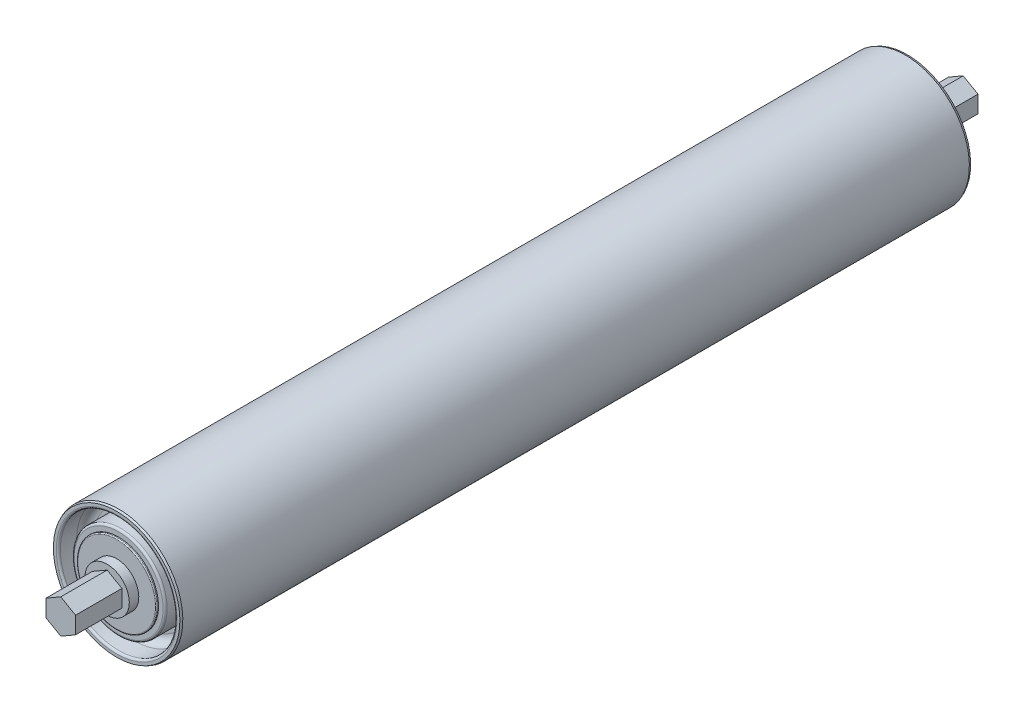
ISO-10303-21;
HEADER;
FILE_DESCRIPTION(('STEP AP214'),'2;1');
FILE_NAME('part.step','',(''),(''),'','','');
FILE_SCHEMA(('AUTOMOTIVE_DESIGN { 1 0 10303 214 1 1 1 1 }'));
ENDSEC;
DATA;
#1=APPLICATION_CONTEXT('core data for automotive mechanical design processes');
#2=APPLICATION_PROTOCOL_DEFINITION('international standard','automotive_design',2000,#1);
#3=PRODUCT_CONTEXT('',#1,'mechanical');
#4=PRODUCT('Part','Part','',(#3));
#5=PRODUCT_RELATED_PRODUCT_CATEGORY('part','',(#4));
#6=PRODUCT_DEFINITION_FORMATION('','',#4);
#7=PRODUCT_DEFINITION_CONTEXT('part definition',#1,'design');
#8=PRODUCT_DEFINITION('design','',#6,#7);
#9=PRODUCT_DEFINITION_SHAPE('','',#8);
#10=(LENGTH_UNIT() NAMED_UNIT(*) SI_UNIT(.MILLI.,.METRE.));
#11=(NAMED_UNIT(*) PLANE_ANGLE_UNIT() SI_UNIT($,.RADIAN.));
#12=(NAMED_UNIT(*) SI_UNIT($,.STERADIAN.) SOLID_ANGLE_UNIT());
#13=UNCERTAINTY_MEASURE_WITH_UNIT(LENGTH_MEASURE(1.E-05),#10,'distance_accuracy_value','');
#14=(GEOMETRIC_REPRESENTATION_CONTEXT(3) GLOBAL_UNCERTAINTY_ASSIGNED_CONTEXT((#13)) GLOBAL_UNIT_ASSIGNED_CONTEXT((#10,
#11,#12)) REPRESENTATION_CONTEXT('',''));
#15=CARTESIAN_POINT('',(0.,0.,0.));
#16=DIRECTION('',(0.,0.,1.));
#17=DIRECTION('',(1.,0.,0.));
#18=AXIS2_PLACEMENT_3D('',#15,#16,#17);
#19=CARTESIAN_POINT('',(0.,23.8125,-148.828125));
#20=DIRECTION('',(0.,0.,1.));
#21=DIRECTION('',(0.,-1.,0.));
#22=AXIS2_PLACEMENT_3D('',#19,#20,#21);
#23=PLANE('',#22);
#24=CARTESIAN_POINT('',(0.,0.,-148.828125));
#25=DIRECTION('',(0.,0.,1.));
#26=DIRECTION('',(0.,-1.,0.));
#27=AXIS2_PLACEMENT_3D('',#24,#25,#26);
#28=CIRCLE('',#27,22.733);
#29=CARTESIAN_POINT('',(0.,-22.733,-148.828125));
#30=VERTEX_POINT('',#29);
#31=EDGE_CURVE('E299',#30,#30,#28,.T.);
#32=ORIENTED_EDGE('',*,*,#31,.T.);
#33=EDGE_LOOP('',(#32));
#34=FACE_BOUND('',#33,.T.);
#35=CARTESIAN_POINT('',(0.,0.,-148.828125));
#36=DIRECTION('',(0.,0.,1.));
#37=DIRECTION('',(0.,-1.,0.));
#38=AXIS2_PLACEMENT_3D('',#35,#36,#37);
#39=CIRCLE('',#38,23.8125);
#40=CARTESIAN_POINT('',(0.,-23.8125,-148.828125));
#41=VERTEX_POINT('',#40);
#42=EDGE_CURVE('E217',#41,#41,#39,.T.);
#43=ORIENTED_EDGE('',*,*,#42,.F.);
#44=EDGE_LOOP('',(#43));
#45=FACE_BOUND('',#44,.T.);
#46=ADVANCED_FACE('F35',(#34,#45),#23,.F.);
#47=CARTESIAN_POINT('',(0.,0.,-148.828125));
#48=DIRECTION('',(0.,0.,1.));
#49=DIRECTION('',(0.,-1.,0.));
#50=AXIS2_PLACEMENT_3D('',#47,#48,#49);
#51=CONICAL_SURFACE('',#50,23.8125,0.380506377112343);
#52=CARTESIAN_POINT('',(0.,0.,-148.034375));
#53=DIRECTION('',(0.,0.,1.));
#54=DIRECTION('',(0.,-1.,0.));
#55=AXIS2_PLACEMENT_3D('',#52,#53,#54);
#56=CIRCLE('',#55,24.13);
#57=CARTESIAN_POINT('',(0.,-24.13,-148.034375));
#58=VERTEX_POINT('',#57);
#59=EDGE_CURVE('E214',#58,#58,#56,.T.);
#60=ORIENTED_EDGE('',*,*,#59,.F.);
#61=EDGE_LOOP('',(#60));
#62=FACE_BOUND('',#61,.T.);
#63=ORIENTED_EDGE('',*,*,#42,.T.);
#64=EDGE_LOOP('',(#63));
#65=FACE_BOUND('',#64,.T.);
#66=ADVANCED_FACE('F385',(#62,#65),#51,.T.);
#67=CARTESIAN_POINT('',(0.,0.,169.8625));
#68=DIRECTION('',(0.,0.,1.));
#69=DIRECTION('',(0.,-1.,0.));
#70=AXIS2_PLACEMENT_3D('',#67,#68,#69);
#71=CYLINDRICAL_SURFACE('',#70,24.13);
#72=CARTESIAN_POINT('',(0.,0.,148.034375));
#73=DIRECTION('',(0.,0.,1.));
#74=DIRECTION('',(0.,-1.,0.));
#75=AXIS2_PLACEMENT_3D('',#72,#73,#74);
#76=CIRCLE('',#75,24.13);
#77=CARTESIAN_POINT('',(0.,-24.13,148.034375));
#78=VERTEX_POINT('',#77);
#79=EDGE_CURVE('E211',#78,#78,#76,.T.);
#80=ORIENTED_EDGE('',*,*,#79,.F.);
#81=EDGE_LOOP('',(#80));
#82=FACE_BOUND('',#81,.T.);
#83=ORIENTED_EDGE('',*,*,#59,.T.);
#84=EDGE_LOOP('',(#83));
#85=FACE_BOUND('',#84,.T.);
#86=ADVANCED_FACE('F390',(#82,#85),#71,.T.);
#87=CARTESIAN_POINT('',(0.,0.,148.034375));
#88=DIRECTION('',(0.,0.,-1.));
#89=DIRECTION('',(0.,1.,0.));
#90=AXIS2_PLACEMENT_3D('',#87,#88,#89);
#91=CONICAL_SURFACE('',#90,24.13,0.380506377112359);
#92=CARTESIAN_POINT('',(0.,0.,148.828125));
#93=DIRECTION('',(0.,0.,1.));
#94=DIRECTION('',(0.,-1.,0.));
#95=AXIS2_PLACEMENT_3D('',#92,#93,#94);
#96=CIRCLE('',#95,23.8125);
#97=CARTESIAN_POINT('',(0.,-23.8125,148.828125));
#98=VERTEX_POINT('',#97);
#99=EDGE_CURVE('E208',#98,#98,#96,.T.);
#100=ORIENTED_EDGE('',*,*,#99,.F.);
#101=EDGE_LOOP('',(#100));
#102=FACE_BOUND('',#101,.T.);
#103=ORIENTED_EDGE('',*,*,#79,.T.);
#104=EDGE_LOOP('',(#103));
#105=FACE_BOUND('',#104,.T.);
#106=ADVANCED_FACE('F469',(#102,#105),#91,.T.);
#107=CARTESIAN_POINT('',(0.,23.8125,148.828125));
#108=DIRECTION('',(0.,0.,-1.));
#109=DIRECTION('',(0.,1.,0.));
#110=AXIS2_PLACEMENT_3D('',#107,#108,#109);
#111=PLANE('',#110);
#112=CARTESIAN_POINT('',(0.,0.,148.828125));
#113=DIRECTION('',(0.,0.,1.));
#114=DIRECTION('',(0.,-1.,0.));
#115=AXIS2_PLACEMENT_3D('',#112,#113,#114);
#116=CIRCLE('',#115,22.733);
#117=CARTESIAN_POINT('',(0.,-22.733,148.828125));
#118=VERTEX_POINT('',#117);
#119=EDGE_CURVE('E134',#118,#118,#116,.T.);
#120=ORIENTED_EDGE('',*,*,#119,.F.);
#121=EDGE_LOOP('',(#120));
#122=FACE_BOUND('',#121,.T.);
#123=ORIENTED_EDGE('',*,*,#99,.T.);
#124=EDGE_LOOP('',(#123));
#125=FACE_BOUND('',#124,.T.);
#126=ADVANCED_FACE('F406',(#122,#125),#111,.F.);
#127=CARTESIAN_POINT('',(0.,0.,148.066125));
#128=DIRECTION('',(0.,0.,1.));
#129=DIRECTION('',(0.,-1.,0.));
#130=AXIS2_PLACEMENT_3D('',#127,#128,#129);
#131=TOROIDAL_SURFACE('',#130,22.733,0.762000000000016);
#132=ORIENTED_EDGE('',*,*,#119,.T.);
#133=EDGE_LOOP('',(#132));
#134=FACE_BOUND('',#133,.T.);
#135=CARTESIAN_POINT('',(0.,0.,148.066125));
#136=DIRECTION('',(0.,0.,1.));
#137=DIRECTION('',(0.,-1.,0.));
#138=AXIS2_PLACEMENT_3D('',#135,#136,#137);
#139=CIRCLE('',#138,21.971);
#140=CARTESIAN_POINT('',(0.,-21.971,148.066125));
#141=VERTEX_POINT('',#140);
#142=EDGE_CURVE('E296',#141,#141,#139,.T.);
#143=ORIENTED_EDGE('',*,*,#142,.F.);
#144=EDGE_LOOP('',(#143));
#145=FACE_BOUND('',#144,.T.);
#146=ADVANCED_FACE('F439',(#134,#145),#131,.T.);
#147=CARTESIAN_POINT('',(0.,0.,148.447125));
#148=DIRECTION('',(0.,0.,1.));
#149=DIRECTION('',(0.,-1.,0.));
#150=AXIS2_PLACEMENT_3D('',#147,#148,#149);
#151=TOROIDAL_SURFACE('',#150,14.620875,0.380999999999987);
#152=CARTESIAN_POINT('',(0.,0.,148.447125));
#153=DIRECTION('',(0.,0.,1.));
#154=DIRECTION('',(0.,-1.,0.));
#155=AXIS2_PLACEMENT_3D('',#152,#153,#154);
#156=CIRCLE('',#155,15.001875);
#157=CARTESIAN_POINT('',(0.,-15.001875,148.447125));
#158=VERTEX_POINT('',#157);
#159=EDGE_CURVE('E275',#158,#158,#156,.T.);
#160=ORIENTED_EDGE('',*,*,#159,.T.);
#161=EDGE_LOOP('',(#160));
#162=FACE_BOUND('',#161,.T.);
#163=CARTESIAN_POINT('',(0.,0.,148.828125));
#164=DIRECTION('',(0.,0.,1.));
#165=DIRECTION('',(0.,-1.,0.));
#166=AXIS2_PLACEMENT_3D('',#163,#164,#165);
#167=CIRCLE('',#166,14.620875);
#168=CARTESIAN_POINT('',(0.,-14.620875,148.828125));
#169=VERTEX_POINT('',#168);
#170=EDGE_CURVE('E272',#169,#169,#167,.T.);
#171=ORIENTED_EDGE('',*,*,#170,.F.);
#172=EDGE_LOOP('',(#171));
#173=FACE_BOUND('',#172,.T.);
#174=ADVANCED_FACE('F435',(#162,#173),#151,.T.);
#175=CARTESIAN_POINT('',(0.,0.,169.8625));
#176=DIRECTION('',(0.,0.,1.));
#177=DIRECTION('',(0.,-1.,0.));
#178=AXIS2_PLACEMENT_3D('',#175,#176,#177);
#179=CYLINDRICAL_SURFACE('',#178,15.001875);
#180=CARTESIAN_POINT('',(0.,0.,148.066125));
#181=DIRECTION('',(0.,0.,1.));
#182=DIRECTION('',(0.,-1.,0.));
#183=AXIS2_PLACEMENT_3D('',#180,#181,#182);
#184=CIRCLE('',#183,15.001875);
#185=CARTESIAN_POINT('',(0.,-15.001875,148.066125));
#186=VERTEX_POINT('',#185);
#187=EDGE_CURVE('E278',#186,#186,#184,.T.);
#188=ORIENTED_EDGE('',*,*,#187,.T.);
#189=EDGE_LOOP('',(#188));
#190=FACE_BOUND('',#189,.T.);
#191=ORIENTED_EDGE('',*,*,#159,.F.);
#192=EDGE_LOOP('',(#191));
#193=FACE_BOUND('',#192,.T.);
#194=ADVANCED_FACE('F431',(#190,#193),#179,.T.);
#195=CARTESIAN_POINT('',(0.,15.001875,148.066125));
#196=DIRECTION('',(0.,0.,1.));
#197=DIRECTION('',(0.,-1.,0.));
#198=AXIS2_PLACEMENT_3D('',#195,#196,#197);
#199=PLANE('',#198);
#200=CARTESIAN_POINT('',(0.,0.,148.066125));
#201=DIRECTION('',(0.,0.,1.));
#202=DIRECTION('',(0.,-1.,0.));
#203=AXIS2_PLACEMENT_3D('',#200,#201,#202);
#204=CIRCLE('',#203,16.7401875);
#205=CARTESIAN_POINT('',(0.,-16.7401875,148.066125));
#206=VERTEX_POINT('',#205);
#207=EDGE_CURVE('E281',#206,#206,#204,.T.);
#208=ORIENTED_EDGE('',*,*,#207,.T.);
#209=EDGE_LOOP('',(#208));
#210=FACE_BOUND('',#209,.T.);
#211=ORIENTED_EDGE('',*,*,#187,.F.);
#212=EDGE_LOOP('',(#211));
#213=FACE_BOUND('',#212,.T.);
#214=ADVANCED_FACE('F427',(#210,#213),#199,.T.);
#215=CARTESIAN_POINT('',(0.,0.,147.304125));
#216=DIRECTION('',(0.,0.,1.));
#217=DIRECTION('',(0.,-1.,0.));
#218=AXIS2_PLACEMENT_3D('',#215,#216,#217);
#219=TOROIDAL_SURFACE('',#218,16.7401875,0.762000000000011);
#220=CARTESIAN_POINT('',(0.,0.,147.304125));
#221=DIRECTION('',(0.,0.,1.));
#222=DIRECTION('',(0.,-1.,0.));
#223=AXIS2_PLACEMENT_3D('',#220,#221,#222);
#224=CIRCLE('',#223,17.5021875);
#225=CARTESIAN_POINT('',(0.,-17.5021875,147.304125));
#226=VERTEX_POINT('',#225);
#227=EDGE_CURVE('E284',#226,#226,#224,.T.);
#228=ORIENTED_EDGE('',*,*,#227,.T.);
#229=EDGE_LOOP('',(#228));
#230=FACE_BOUND('',#229,.T.);
#231=ORIENTED_EDGE('',*,*,#207,.F.);
#232=EDGE_LOOP('',(#231));
#233=FACE_BOUND('',#232,.T.);
#234=ADVANCED_FACE('F423',(#230,#233),#219,.T.);
#235=CARTESIAN_POINT('',(0.,0.,169.8625));
#236=DIRECTION('',(0.,0.,1.));
#237=DIRECTION('',(0.,-1.,0.));
#238=AXIS2_PLACEMENT_3D('',#235,#236,#237);
#239=CYLINDRICAL_SURFACE('',#238,17.5021875);
#240=CARTESIAN_POINT('',(0.,0.,138.90625));
#241=DIRECTION('',(0.,0.,1.));
#242=DIRECTION('',(0.,-1.,0.));
#243=AXIS2_PLACEMENT_3D('',#240,#241,#242);
#244=CIRCLE('',#243,17.5021875);
#245=CARTESIAN_POINT('',(0.,-17.5021875,138.90625));
#246=VERTEX_POINT('',#245);
#247=EDGE_CURVE('E287',#246,#246,#244,.T.);
#248=ORIENTED_EDGE('',*,*,#247,.T.);
#249=EDGE_LOOP('',(#248));
#250=FACE_BOUND('',#249,.T.);
#251=ORIENTED_EDGE('',*,*,#227,.F.);
#252=EDGE_LOOP('',(#251));
#253=FACE_BOUND('',#252,.T.);
#254=ADVANCED_FACE('F419',(#250,#253),#239,.T.);
#255=CARTESIAN_POINT('',(0.,17.5021875,138.90625));
#256=DIRECTION('',(0.,0.,1.));
#257=DIRECTION('',(0.,-1.,0.));
#258=AXIS2_PLACEMENT_3D('',#255,#256,#257);
#259=PLANE('',#258);
#260=CARTESIAN_POINT('',(0.,0.,138.90625));
#261=DIRECTION('',(0.,0.,1.));
#262=DIRECTION('',(0.,-1.,0.));
#263=AXIS2_PLACEMENT_3D('',#260,#261,#262);
#264=CIRCLE('',#263,18.923);
#265=CARTESIAN_POINT('',(0.,-18.923,138.90625));
#266=VERTEX_POINT('',#265);
#267=EDGE_CURVE('E290',#266,#266,#264,.T.);
#268=ORIENTED_EDGE('',*,*,#267,.T.);
#269=EDGE_LOOP('',(#268));
#270=FACE_BOUND('',#269,.T.);
#271=ORIENTED_EDGE('',*,*,#247,.F.);
#272=EDGE_LOOP('',(#271));
#273=FACE_BOUND('',#272,.T.);
#274=ADVANCED_FACE('F415',(#270,#273),#259,.T.);
#275=CARTESIAN_POINT('',(0.,0.,141.95425));
#276=DIRECTION('',(0.,0.,1.));
#277=DIRECTION('',(0.,-1.,0.));
#278=AXIS2_PLACEMENT_3D('',#275,#276,#277);
#279=TOROIDAL_SURFACE('',#278,18.923,3.04799999999999);
#280=CARTESIAN_POINT('',(0.,0.,141.95425));
#281=DIRECTION('',(0.,0.,1.));
#282=DIRECTION('',(0.,-1.,0.));
#283=AXIS2_PLACEMENT_3D('',#280,#281,#282);
#284=CIRCLE('',#283,21.971);
#285=CARTESIAN_POINT('',(0.,-21.971,141.95425));
#286=VERTEX_POINT('',#285);
#287=EDGE_CURVE('E293',#286,#286,#284,.T.);
#288=ORIENTED_EDGE('',*,*,#287,.T.);
#289=EDGE_LOOP('',(#288));
#290=FACE_BOUND('',#289,.T.);
#291=ORIENTED_EDGE('',*,*,#267,.F.);
#292=EDGE_LOOP('',(#291));
#293=FACE_BOUND('',#292,.T.);
#294=ADVANCED_FACE('F411',(#290,#293),#279,.F.);
#295=CARTESIAN_POINT('',(0.,0.,169.8625));
#296=DIRECTION('',(0.,0.,1.));
#297=DIRECTION('',(0.,-1.,0.));
#298=AXIS2_PLACEMENT_3D('',#295,#296,#297);
#299=CYLINDRICAL_SURFACE('',#298,21.971);
#300=ORIENTED_EDGE('',*,*,#142,.T.);
#301=EDGE_LOOP('',(#300));
#302=FACE_BOUND('',#301,.T.);
#303=ORIENTED_EDGE('',*,*,#287,.F.);
#304=EDGE_LOOP('',(#303));
#305=FACE_BOUND('',#304,.T.);
#306=ADVANCED_FACE('F408',(#302,#305),#299,.F.);
#307=CARTESIAN_POINT('',(0.,0.,169.8625));
#308=DIRECTION('',(0.,0.,-1.));
#309=DIRECTION('',(0.,1.,0.));
#310=AXIS2_PLACEMENT_3D('',#307,#308,#309);
#311=PLANE('',#310);
#312=DIRECTION('',(0.866025403784439,0.5,0.));
#313=VECTOR('',#312,1.);
#314=CARTESIAN_POINT('',(0.,-6.41580486636974,169.8625));
#315=LINE('',#314,#313);
#316=CARTESIAN_POINT('',(0.,-6.41580486636974,169.8625));
#317=VERTEX_POINT('',#316);
#318=CARTESIAN_POINT('',(5.55625,-3.20790243318488,169.8625));
#319=VERTEX_POINT('',#318);
#320=EDGE_CURVE('E154',#317,#319,#315,.T.);
#321=ORIENTED_EDGE('',*,*,#320,.T.);
#322=DIRECTION('',(0.,1.,0.));
#323=VECTOR('',#322,1.);
#324=CARTESIAN_POINT('',(5.55625,-3.20790243318488,169.8625));
#325=LINE('',#324,#323);
#326=CARTESIAN_POINT('',(5.55625,3.20790243318484,169.8625));
#327=VERTEX_POINT('',#326);
#328=EDGE_CURVE('E130',#319,#327,#325,.T.);
#329=ORIENTED_EDGE('',*,*,#328,.T.);
#330=DIRECTION('',(-0.866025403784439,0.5,0.));
#331=VECTOR('',#330,1.);
#332=CARTESIAN_POINT('',(5.55625,3.20790243318484,169.8625));
#333=LINE('',#332,#331);
#334=CARTESIAN_POINT('',(0.,6.41580486636969,169.8625));
#335=VERTEX_POINT('',#334);
#336=EDGE_CURVE('E123',#327,#335,#333,.T.);
#337=ORIENTED_EDGE('',*,*,#336,.T.);
#338=DIRECTION('',(-0.866025403784439,-0.5,0.));
#339=VECTOR('',#338,1.);
#340=CARTESIAN_POINT('',(0.,6.41580486636969,169.8625));
#341=LINE('',#340,#339);
#342=CARTESIAN_POINT('',(-5.55625,3.20790243318484,169.8625));
#343=VERTEX_POINT('',#342);
#344=EDGE_CURVE('E127',#335,#343,#341,.T.);
#345=ORIENTED_EDGE('',*,*,#344,.T.);
#346=DIRECTION('',(0.,-1.,0.));
#347=VECTOR('',#346,1.);
#348=CARTESIAN_POINT('',(-5.55625,3.20790243318484,169.8625));
#349=LINE('',#348,#347);
#350=CARTESIAN_POINT('',(-5.55625,-3.20790243318488,169.8625));
#351=VERTEX_POINT('',#350);
#352=EDGE_CURVE('E147',#343,#351,#349,.T.);
#353=ORIENTED_EDGE('',*,*,#352,.T.);
#354=DIRECTION('',(0.866025403784439,-0.5,0.));
#355=VECTOR('',#354,1.);
#356=CARTESIAN_POINT('',(-5.55625,-3.20790243318488,169.8625));
#357=LINE('',#356,#355);
#358=EDGE_CURVE('E149',#351,#317,#357,.T.);
#359=ORIENTED_EDGE('',*,*,#358,.T.);
#360=EDGE_LOOP('',(#321,#329,#337,#345,#353,#359));
#361=FACE_BOUND('',#360,.T.);
#362=ADVANCED_FACE('F125',(#361),#311,.F.);
#363=CARTESIAN_POINT('',(-5.55625,3.20790243318484,-186.837124136732));
#364=DIRECTION('',(-1.,0.,0.));
#365=DIRECTION('',(0.,-1.,0.));
#366=AXIS2_PLACEMENT_3D('',#363,#364,#365);
#367=PLANE('',#366);
#368=DIRECTION('',(0.,1.,0.));
#369=VECTOR('',#368,1.);
#370=CARTESIAN_POINT('',(-5.55625,8.334375,152.4));
#371=LINE('',#370,#369);
#372=CARTESIAN_POINT('',(-5.55625,-3.20790243318488,152.4));
#373=VERTEX_POINT('',#372);
#374=CARTESIAN_POINT('',(-5.55625,3.20790243318484,152.4));
#375=VERTEX_POINT('',#374);
#376=EDGE_CURVE('E183',#373,#375,#371,.T.);
#377=ORIENTED_EDGE('',*,*,#376,.F.);
#378=DIRECTION('',(0.,0.,1.));
#379=VECTOR('',#378,1.);
#380=CARTESIAN_POINT('',(-5.55625,-3.20790243318488,-186.837124136732));
#381=LINE('',#380,#379);
#382=EDGE_CURVE('E173',#373,#351,#381,.T.);
#383=ORIENTED_EDGE('',*,*,#382,.T.);
#384=ORIENTED_EDGE('',*,*,#352,.F.);
#385=DIRECTION('',(0.,0.,1.));
#386=VECTOR('',#385,1.);
#387=CARTESIAN_POINT('',(-5.55625,3.20790243318484,-186.837124136732));
#388=LINE('',#387,#386);
#389=EDGE_CURVE('E145',#375,#343,#388,.T.);
#390=ORIENTED_EDGE('',*,*,#389,.F.);
#391=EDGE_LOOP('',(#377,#383,#384,#390));
#392=FACE_BOUND('',#391,.T.);
#393=ADVANCED_FACE('F455',(#392),#367,.T.);
#394=CARTESIAN_POINT('',(-5.55625,-3.20790243318488,-186.837124136732));
#395=DIRECTION('',(-0.5,-0.866025403784439,0.));
#396=DIRECTION('',(0.866025403784439,-0.5,0.));
#397=AXIS2_PLACEMENT_3D('',#394,#395,#396);
#398=PLANE('',#397);
#399=DIRECTION('',(-0.866025403784439,0.5,0.));
#400=VECTOR('',#399,1.);
#401=CARTESIAN_POINT('',(-6.38701523733297,-2.7282598997773,152.4));
#402=LINE('',#401,#400);
#403=CARTESIAN_POINT('',(0.,-6.41580486636974,152.4));
#404=VERTEX_POINT('',#403);
#405=EDGE_CURVE('E187',#404,#373,#402,.T.);
#406=ORIENTED_EDGE('',*,*,#405,.F.);
#407=DIRECTION('',(0.,0.,1.));
#408=VECTOR('',#407,1.);
#409=CARTESIAN_POINT('',(0.,-6.41580486636974,-186.837124136732));
#410=LINE('',#409,#408);
#411=EDGE_CURVE('E169',#404,#317,#410,.T.);
#412=ORIENTED_EDGE('',*,*,#411,.T.);
#413=ORIENTED_EDGE('',*,*,#358,.F.);
#414=ORIENTED_EDGE('',*,*,#382,.F.);
#415=EDGE_LOOP('',(#406,#412,#413,#414));
#416=FACE_BOUND('',#415,.T.);
#417=ADVANCED_FACE('F452',(#416),#398,.T.);
#418=CARTESIAN_POINT('',(0.,-6.41580486636974,-186.837124136732));
#419=DIRECTION('',(0.5,-0.866025403784439,0.));
#420=DIRECTION('',(0.866025403784439,0.5,0.));
#421=AXIS2_PLACEMENT_3D('',#418,#419,#420);
#422=PLANE('',#421);
#423=DIRECTION('',(-0.866025403784439,-0.5,0.));
#424=VECTOR('',#423,1.);
#425=CARTESIAN_POINT('',(6.38701523733297,-2.72825989977731,152.4));
#426=LINE('',#425,#424);
#427=CARTESIAN_POINT('',(5.55625,-3.20790243318488,152.4));
#428=VERTEX_POINT('',#427);
#429=EDGE_CURVE('E191',#428,#404,#426,.T.);
#430=ORIENTED_EDGE('',*,*,#429,.F.);
#431=DIRECTION('',(0.,0.,1.));
#432=VECTOR('',#431,1.);
#433=CARTESIAN_POINT('',(5.55625,-3.20790243318488,-186.837124136732));
#434=LINE('',#433,#432);
#435=EDGE_CURVE('E165',#428,#319,#434,.T.);
#436=ORIENTED_EDGE('',*,*,#435,.T.);
#437=ORIENTED_EDGE('',*,*,#320,.F.);
#438=ORIENTED_EDGE('',*,*,#411,.F.);
#439=EDGE_LOOP('',(#430,#436,#437,#438));
#440=FACE_BOUND('',#439,.T.);
#441=ADVANCED_FACE('F449',(#440),#422,.T.);
#442=CARTESIAN_POINT('',(5.55625,-3.20790243318488,-186.837124136732));
#443=DIRECTION('',(1.,0.,0.));
#444=DIRECTION('',(0.,1.,0.));
#445=AXIS2_PLACEMENT_3D('',#442,#443,#444);
#446=PLANE('',#445);
#447=DIRECTION('',(0.,-1.,0.));
#448=VECTOR('',#447,1.);
#449=CARTESIAN_POINT('',(5.55624999999999,8.334375,152.4));
#450=LINE('',#449,#448);
#451=CARTESIAN_POINT('',(5.55625,3.20790243318484,152.4));
#452=VERTEX_POINT('',#451);
#453=EDGE_CURVE('E195',#452,#428,#450,.T.);
#454=ORIENTED_EDGE('',*,*,#453,.F.);
#455=DIRECTION('',(0.,0.,1.));
#456=VECTOR('',#455,1.);
#457=CARTESIAN_POINT('',(5.55625,3.20790243318484,-186.837124136732));
#458=LINE('',#457,#456);
#459=EDGE_CURVE('E161',#452,#327,#458,.T.);
#460=ORIENTED_EDGE('',*,*,#459,.T.);
#461=ORIENTED_EDGE('',*,*,#328,.F.);
#462=ORIENTED_EDGE('',*,*,#435,.F.);
#463=EDGE_LOOP('',(#454,#460,#461,#462));
#464=FACE_BOUND('',#463,.T.);
#465=ADVANCED_FACE('F446',(#464),#446,.T.);
#466=CARTESIAN_POINT('',(5.55625,3.20790243318484,-186.837124136732));
#467=DIRECTION('',(0.5,0.866025403784439,0.));
#468=DIRECTION('',(-0.866025403784439,0.5,0.));
#469=AXIS2_PLACEMENT_3D('',#466,#467,#468);
#470=PLANE('',#469);
#471=DIRECTION('',(0.866025403784439,-0.5,0.));
#472=VECTOR('',#471,1.);
#473=CARTESIAN_POINT('',(-0.830765237332975,6.89544739977727,152.4));
#474=LINE('',#473,#472);
#475=CARTESIAN_POINT('',(0.,6.41580486636969,152.4));
#476=VERTEX_POINT('',#475);
#477=EDGE_CURVE('E139',#476,#452,#474,.T.);
#478=ORIENTED_EDGE('',*,*,#477,.F.);
#479=DIRECTION('',(0.,0.,1.));
#480=VECTOR('',#479,1.);
#481=CARTESIAN_POINT('',(0.,6.41580486636969,-186.837124136732));
#482=LINE('',#481,#480);
#483=EDGE_CURVE('E137',#476,#335,#482,.T.);
#484=ORIENTED_EDGE('',*,*,#483,.T.);
#485=ORIENTED_EDGE('',*,*,#336,.F.);
#486=ORIENTED_EDGE('',*,*,#459,.F.);
#487=EDGE_LOOP('',(#478,#484,#485,#486));
#488=FACE_BOUND('',#487,.T.);
#489=ADVANCED_FACE('F138',(#488),#470,.T.);
#490=CARTESIAN_POINT('',(0.,6.41580486636969,-186.837124136732));
#491=DIRECTION('',(-0.5,0.866025403784439,0.));
#492=DIRECTION('',(-0.866025403784439,-0.5,0.));
#493=AXIS2_PLACEMENT_3D('',#490,#491,#492);
#494=PLANE('',#493);
#495=DIRECTION('',(0.866025403784439,0.5,0.));
#496=VECTOR('',#495,1.);
#497=CARTESIAN_POINT('',(0.830765237332975,6.89544739977727,152.4));
#498=LINE('',#497,#496);
#499=EDGE_CURVE('E58',#375,#476,#498,.T.);
#500=ORIENTED_EDGE('',*,*,#499,.F.);
#501=ORIENTED_EDGE('',*,*,#389,.T.);
#502=ORIENTED_EDGE('',*,*,#344,.F.);
#503=ORIENTED_EDGE('',*,*,#483,.F.);
#504=EDGE_LOOP('',(#500,#501,#502,#503));
#505=FACE_BOUND('',#504,.T.);
#506=ADVANCED_FACE('F143',(#505),#494,.T.);
#507=CARTESIAN_POINT('',(0.,8.334375,152.4));
#508=DIRECTION('',(0.,0.,-1.));
#509=DIRECTION('',(0.,1.,0.));
#510=AXIS2_PLACEMENT_3D('',#507,#508,#509);
#511=PLANE('',#510);
#512=ORIENTED_EDGE('',*,*,#499,.T.);
#513=ORIENTED_EDGE('',*,*,#477,.T.);
#514=ORIENTED_EDGE('',*,*,#453,.T.);
#515=ORIENTED_EDGE('',*,*,#429,.T.);
#516=ORIENTED_EDGE('',*,*,#405,.T.);
#517=ORIENTED_EDGE('',*,*,#376,.T.);
#518=EDGE_LOOP('',(#512,#513,#514,#515,#516,#517));
#519=FACE_BOUND('',#518,.T.);
#520=CARTESIAN_POINT('',(0.,0.,152.4));
#521=DIRECTION('',(0.,0.,1.));
#522=DIRECTION('',(0.,-1.,0.));
#523=AXIS2_PLACEMENT_3D('',#520,#521,#522);
#524=CIRCLE('',#523,8.334375);
#525=CARTESIAN_POINT('',(0.,-8.334375,152.4));
#526=VERTEX_POINT('',#525);
#527=EDGE_CURVE('E202',#526,#526,#524,.T.);
#528=ORIENTED_EDGE('',*,*,#527,.T.);
#529=EDGE_LOOP('',(#528));
#530=FACE_BOUND('',#529,.T.);
#531=ADVANCED_FACE('F462',(#519,#530),#511,.F.);
#532=CARTESIAN_POINT('',(0.,0.,169.8625));
#533=DIRECTION('',(0.,0.,1.));
#534=DIRECTION('',(0.,-1.,0.));
#535=AXIS2_PLACEMENT_3D('',#532,#533,#534);
#536=CYLINDRICAL_SURFACE('',#535,8.334375);
#537=ORIENTED_EDGE('',*,*,#527,.F.);
#538=EDGE_LOOP('',(#537));
#539=FACE_BOUND('',#538,.T.);
#540=CARTESIAN_POINT('',(0.,0.,148.828125));
#541=DIRECTION('',(0.,0.,1.));
#542=DIRECTION('',(0.,-1.,0.));
#543=AXIS2_PLACEMENT_3D('',#540,#541,#542);
#544=CIRCLE('',#543,8.334375);
#545=CARTESIAN_POINT('',(0.,-8.334375,148.828125));
#546=VERTEX_POINT('',#545);
#547=EDGE_CURVE('E205',#546,#546,#544,.T.);
#548=ORIENTED_EDGE('',*,*,#547,.T.);
#549=EDGE_LOOP('',(#548));
#550=FACE_BOUND('',#549,.T.);
#551=ADVANCED_FACE('F403',(#539,#550),#536,.T.);
#552=ORIENTED_EDGE('',*,*,#547,.F.);
#553=EDGE_LOOP('',(#552));
#554=FACE_BOUND('',#553,.T.);
#555=ORIENTED_EDGE('',*,*,#170,.T.);
#556=EDGE_LOOP('',(#555));
#557=FACE_BOUND('',#556,.T.);
#558=ADVANCED_FACE('F398',(#554,#557),#111,.F.);
#559=CARTESIAN_POINT('',(0.,0.,-148.066125));
#560=DIRECTION('',(0.,0.,-1.));
#561=DIRECTION('',(0.,-1.,0.));
#562=AXIS2_PLACEMENT_3D('',#559,#560,#561);
#563=TOROIDAL_SURFACE('',#562,22.733,0.762000000000016);
#564=ORIENTED_EDGE('',*,*,#31,.F.);
#565=EDGE_LOOP('',(#564));
#566=FACE_BOUND('',#565,.T.);
#567=CARTESIAN_POINT('',(0.,0.,-148.066125));
#568=DIRECTION('',(0.,0.,1.));
#569=DIRECTION('',(0.,-1.,0.));
#570=AXIS2_PLACEMENT_3D('',#567,#568,#569);
#571=CIRCLE('',#570,21.971);
#572=CARTESIAN_POINT('',(0.,-21.971,-148.066125));
#573=VERTEX_POINT('',#572);
#574=EDGE_CURVE('E326',#573,#573,#571,.T.);
#575=ORIENTED_EDGE('',*,*,#574,.T.);
#576=EDGE_LOOP('',(#575));
#577=FACE_BOUND('',#576,.T.);
#578=ADVANCED_FACE('F330',(#566,#577),#563,.T.);
#579=CARTESIAN_POINT('',(0.,0.,-148.447125));
#580=DIRECTION('',(0.,0.,-1.));
#581=DIRECTION('',(0.,-1.,0.));
#582=AXIS2_PLACEMENT_3D('',#579,#580,#581);
#583=TOROIDAL_SURFACE('',#582,14.620875,0.380999999999987);
#584=CARTESIAN_POINT('',(0.,0.,-148.447125));
#585=DIRECTION('',(0.,0.,1.));
#586=DIRECTION('',(0.,-1.,0.));
#587=AXIS2_PLACEMENT_3D('',#584,#585,#586);
#588=CIRCLE('',#587,15.001875);
#589=CARTESIAN_POINT('',(0.,-15.001875,-148.447125));
#590=VERTEX_POINT('',#589);
#591=EDGE_CURVE('E305',#590,#590,#588,.T.);
#592=ORIENTED_EDGE('',*,*,#591,.F.);
#593=EDGE_LOOP('',(#592));
#594=FACE_BOUND('',#593,.T.);
#595=CARTESIAN_POINT('',(0.,0.,-148.828125));
#596=DIRECTION('',(0.,0.,1.));
#597=DIRECTION('',(0.,-1.,0.));
#598=AXIS2_PLACEMENT_3D('',#595,#596,#597);
#599=CIRCLE('',#598,14.620875);
#600=CARTESIAN_POINT('',(0.,-14.620875,-148.828125));
#601=VERTEX_POINT('',#600);
#602=EDGE_CURVE('E302',#601,#601,#599,.T.);
#603=ORIENTED_EDGE('',*,*,#602,.T.);
#604=EDGE_LOOP('',(#603));
#605=FACE_BOUND('',#604,.T.);
#606=ADVANCED_FACE('F371',(#594,#605),#583,.T.);
#607=CARTESIAN_POINT('',(0.,0.,-169.8625));
#608=DIRECTION('',(0.,0.,-1.));
#609=DIRECTION('',(0.,-1.,0.));
#610=AXIS2_PLACEMENT_3D('',#607,#608,#609);
#611=CYLINDRICAL_SURFACE('',#610,15.001875);
#612=CARTESIAN_POINT('',(0.,0.,-148.066125));
#613=DIRECTION('',(0.,0.,1.));
#614=DIRECTION('',(0.,-1.,0.));
#615=AXIS2_PLACEMENT_3D('',#612,#613,#614);
#616=CIRCLE('',#615,15.001875);
#617=CARTESIAN_POINT('',(0.,-15.001875,-148.066125));
#618=VERTEX_POINT('',#617);
#619=EDGE_CURVE('E308',#618,#618,#616,.T.);
#620=ORIENTED_EDGE('',*,*,#619,.F.);
#621=EDGE_LOOP('',(#620));
#622=FACE_BOUND('',#621,.T.);
#623=ORIENTED_EDGE('',*,*,#591,.T.);
#624=EDGE_LOOP('',(#623));
#625=FACE_BOUND('',#624,.T.);
#626=ADVANCED_FACE('F365',(#622,#625),#611,.T.);
#627=CARTESIAN_POINT('',(0.,15.001875,-148.066125));
#628=DIRECTION('',(0.,0.,-1.));
#629=DIRECTION('',(0.,-1.,0.));
#630=AXIS2_PLACEMENT_3D('',#627,#628,#629);
#631=PLANE('',#630);
#632=CARTESIAN_POINT('',(0.,0.,-148.066125));
#633=DIRECTION('',(0.,0.,1.));
#634=DIRECTION('',(0.,-1.,0.));
#635=AXIS2_PLACEMENT_3D('',#632,#633,#634);
#636=CIRCLE('',#635,16.7401875);
#637=CARTESIAN_POINT('',(0.,-16.7401875,-148.066125));
#638=VERTEX_POINT('',#637);
#639=EDGE_CURVE('E311',#638,#638,#636,.T.);
#640=ORIENTED_EDGE('',*,*,#639,.F.);
#641=EDGE_LOOP('',(#640));
#642=FACE_BOUND('',#641,.T.);
#643=ORIENTED_EDGE('',*,*,#619,.T.);
#644=EDGE_LOOP('',(#643));
#645=FACE_BOUND('',#644,.T.);
#646=ADVANCED_FACE('F359',(#642,#645),#631,.T.);
#647=CARTESIAN_POINT('',(0.,0.,-147.304125));
#648=DIRECTION('',(0.,0.,-1.));
#649=DIRECTION('',(0.,-1.,0.));
#650=AXIS2_PLACEMENT_3D('',#647,#648,#649);
#651=TOROIDAL_SURFACE('',#650,16.7401875,0.762000000000011);
#652=CARTESIAN_POINT('',(0.,0.,-147.304125));
#653=DIRECTION('',(0.,0.,1.));
#654=DIRECTION('',(0.,-1.,0.));
#655=AXIS2_PLACEMENT_3D('',#652,#653,#654);
#656=CIRCLE('',#655,17.5021875);
#657=CARTESIAN_POINT('',(0.,-17.5021875,-147.304125));
#658=VERTEX_POINT('',#657);
#659=EDGE_CURVE('E314',#658,#658,#656,.T.);
#660=ORIENTED_EDGE('',*,*,#659,.F.);
#661=EDGE_LOOP('',(#660));
#662=FACE_BOUND('',#661,.T.);
#663=ORIENTED_EDGE('',*,*,#639,.T.);
#664=EDGE_LOOP('',(#663));
#665=FACE_BOUND('',#664,.T.);
#666=ADVANCED_FACE('F353',(#662,#665),#651,.T.);
#667=CARTESIAN_POINT('',(0.,0.,-169.8625));
#668=DIRECTION('',(0.,0.,-1.));
#669=DIRECTION('',(0.,-1.,0.));
#670=AXIS2_PLACEMENT_3D('',#667,#668,#669);
#671=CYLINDRICAL_SURFACE('',#670,17.5021875);
#672=CARTESIAN_POINT('',(0.,0.,-138.90625));
#673=DIRECTION('',(0.,0.,1.));
#674=DIRECTION('',(0.,-1.,0.));
#675=AXIS2_PLACEMENT_3D('',#672,#673,#674);
#676=CIRCLE('',#675,17.5021875);
#677=CARTESIAN_POINT('',(0.,-17.5021875,-138.90625));
#678=VERTEX_POINT('',#677);
#679=EDGE_CURVE('E317',#678,#678,#676,.T.);
#680=ORIENTED_EDGE('',*,*,#679,.F.);
#681=EDGE_LOOP('',(#680));
#682=FACE_BOUND('',#681,.T.);
#683=ORIENTED_EDGE('',*,*,#659,.T.);
#684=EDGE_LOOP('',(#683));
#685=FACE_BOUND('',#684,.T.);
#686=ADVANCED_FACE('F347',(#682,#685),#671,.T.);
#687=CARTESIAN_POINT('',(0.,17.5021875,-138.90625));
#688=DIRECTION('',(0.,0.,-1.));
#689=DIRECTION('',(0.,-1.,0.));
#690=AXIS2_PLACEMENT_3D('',#687,#688,#689);
#691=PLANE('',#690);
#692=CARTESIAN_POINT('',(0.,0.,-138.90625));
#693=DIRECTION('',(0.,0.,1.));
#694=DIRECTION('',(0.,-1.,0.));
#695=AXIS2_PLACEMENT_3D('',#692,#693,#694);
#696=CIRCLE('',#695,18.923);
#697=CARTESIAN_POINT('',(0.,-18.923,-138.90625));
#698=VERTEX_POINT('',#697);
#699=EDGE_CURVE('E320',#698,#698,#696,.T.);
#700=ORIENTED_EDGE('',*,*,#699,.F.);
#701=EDGE_LOOP('',(#700));
#702=FACE_BOUND('',#701,.T.);
#703=ORIENTED_EDGE('',*,*,#679,.T.);
#704=EDGE_LOOP('',(#703));
#705=FACE_BOUND('',#704,.T.);
#706=ADVANCED_FACE('F341',(#702,#705),#691,.T.);
#707=CARTESIAN_POINT('',(0.,0.,-141.95425));
#708=DIRECTION('',(0.,0.,-1.));
#709=DIRECTION('',(0.,-1.,0.));
#710=AXIS2_PLACEMENT_3D('',#707,#708,#709);
#711=TOROIDAL_SURFACE('',#710,18.923,3.04799999999999);
#712=CARTESIAN_POINT('',(0.,0.,-141.95425));
#713=DIRECTION('',(0.,0.,1.));
#714=DIRECTION('',(0.,-1.,0.));
#715=AXIS2_PLACEMENT_3D('',#712,#713,#714);
#716=CIRCLE('',#715,21.971);
#717=CARTESIAN_POINT('',(0.,-21.971,-141.95425));
#718=VERTEX_POINT('',#717);
#719=EDGE_CURVE('E323',#718,#718,#716,.T.);
#720=ORIENTED_EDGE('',*,*,#719,.F.);
#721=EDGE_LOOP('',(#720));
#722=FACE_BOUND('',#721,.T.);
#723=ORIENTED_EDGE('',*,*,#699,.T.);
#724=EDGE_LOOP('',(#723));
#725=FACE_BOUND('',#724,.T.);
#726=ADVANCED_FACE('F335',(#722,#725),#711,.F.);
#727=CARTESIAN_POINT('',(0.,0.,-169.8625));
#728=DIRECTION('',(0.,0.,-1.));
#729=DIRECTION('',(0.,-1.,0.));
#730=AXIS2_PLACEMENT_3D('',#727,#728,#729);
#731=CYLINDRICAL_SURFACE('',#730,21.971);
#732=ORIENTED_EDGE('',*,*,#574,.F.);
#733=EDGE_LOOP('',(#732));
#734=FACE_BOUND('',#733,.T.);
#735=ORIENTED_EDGE('',*,*,#719,.T.);
#736=EDGE_LOOP('',(#735));
#737=FACE_BOUND('',#736,.T.);
#738=ADVANCED_FACE('F332',(#734,#737),#731,.F.);
#739=CARTESIAN_POINT('',(0.,0.,-169.8625));
#740=DIRECTION('',(0.,0.,1.));
#741=DIRECTION('',(0.,-1.,0.));
#742=AXIS2_PLACEMENT_3D('',#739,#740,#741);
#743=PLANE('',#742);
#744=DIRECTION('',(0.866025403784439,-0.5,0.));
#745=VECTOR('',#744,1.);
#746=CARTESIAN_POINT('',(5.55625,3.20790243318484,-169.8625));
#747=LINE('',#746,#745);
#748=CARTESIAN_POINT('',(0.,6.41580486636969,-169.8625));
#749=VERTEX_POINT('',#748);
#750=CARTESIAN_POINT('',(5.55625,3.20790243318484,-169.8625));
#751=VERTEX_POINT('',#750);
#752=EDGE_CURVE('E180',#749,#751,#747,.T.);
#753=ORIENTED_EDGE('',*,*,#752,.T.);
#754=DIRECTION('',(0.,-1.,0.));
#755=VECTOR('',#754,1.);
#756=CARTESIAN_POINT('',(5.55625,-3.20790243318488,-169.8625));
#757=LINE('',#756,#755);
#758=CARTESIAN_POINT('',(5.55625,-3.20790243318488,-169.8625));
#759=VERTEX_POINT('',#758);
#760=EDGE_CURVE('E253',#751,#759,#757,.T.);
#761=ORIENTED_EDGE('',*,*,#760,.T.);
#762=DIRECTION('',(-0.866025403784439,-0.5,0.));
#763=VECTOR('',#762,1.);
#764=CARTESIAN_POINT('',(0.,-6.41580486636974,-169.8625));
#765=LINE('',#764,#763);
#766=CARTESIAN_POINT('',(0.,-6.41580486636974,-169.8625));
#767=VERTEX_POINT('',#766);
#768=EDGE_CURVE('E250',#759,#767,#765,.T.);
#769=ORIENTED_EDGE('',*,*,#768,.T.);
#770=DIRECTION('',(-0.866025403784439,0.5,0.));
#771=VECTOR('',#770,1.);
#772=CARTESIAN_POINT('',(-5.55625,-3.20790243318488,-169.8625));
#773=LINE('',#772,#771);
#774=CARTESIAN_POINT('',(-5.55625,-3.20790243318488,-169.8625));
#775=VERTEX_POINT('',#774);
#776=EDGE_CURVE('E246',#767,#775,#773,.T.);
#777=ORIENTED_EDGE('',*,*,#776,.T.);
#778=DIRECTION('',(0.,1.,0.));
#779=VECTOR('',#778,1.);
#780=CARTESIAN_POINT('',(-5.55625,3.20790243318483,-169.8625));
#781=LINE('',#780,#779);
#782=CARTESIAN_POINT('',(-5.55625,3.20790243318484,-169.8625));
#783=VERTEX_POINT('',#782);
#784=EDGE_CURVE('E160',#775,#783,#781,.T.);
#785=ORIENTED_EDGE('',*,*,#784,.T.);
#786=DIRECTION('',(0.866025403784439,0.5,0.));
#787=VECTOR('',#786,1.);
#788=CARTESIAN_POINT('',(0.,6.41580486636969,-169.8625));
#789=LINE('',#788,#787);
#790=EDGE_CURVE('E177',#783,#749,#789,.T.);
#791=ORIENTED_EDGE('',*,*,#790,.T.);
#792=EDGE_LOOP('',(#753,#761,#769,#777,#785,#791));
#793=FACE_BOUND('',#792,.T.);
#794=ADVANCED_FACE('F37',(#793),#743,.F.);
#795=CARTESIAN_POINT('',(-5.55625,-3.20790243318488,-152.4));
#796=VERTEX_POINT('',#795);
#797=EDGE_CURVE('E170',#775,#796,#381,.T.);
#798=ORIENTED_EDGE('',*,*,#797,.T.);
#799=DIRECTION('',(0.,-1.,0.));
#800=VECTOR('',#799,1.);
#801=CARTESIAN_POINT('',(-5.55625,8.33437500000004,-152.4));
#802=LINE('',#801,#800);
#803=CARTESIAN_POINT('',(-5.55625,3.20790243318484,-152.4));
#804=VERTEX_POINT('',#803);
#805=EDGE_CURVE('E185',#804,#796,#802,.T.);
#806=ORIENTED_EDGE('',*,*,#805,.F.);
#807=EDGE_CURVE('E174',#783,#804,#388,.T.);
#808=ORIENTED_EDGE('',*,*,#807,.F.);
#809=ORIENTED_EDGE('',*,*,#784,.F.);
#810=EDGE_LOOP('',(#798,#806,#808,#809));
#811=FACE_BOUND('',#810,.T.);
#812=ADVANCED_FACE('F268',(#811),#367,.T.);
#813=ORIENTED_EDGE('',*,*,#807,.T.);
#814=DIRECTION('',(-0.866025403784439,-0.5,0.));
#815=VECTOR('',#814,1.);
#816=CARTESIAN_POINT('',(0.830765237332991,6.89544739977728,-152.4));
#817=LINE('',#816,#815);
#818=CARTESIAN_POINT('',(0.,6.41580486636969,-152.4));
#819=VERTEX_POINT('',#818);
#820=EDGE_CURVE('E50',#819,#804,#817,.T.);
#821=ORIENTED_EDGE('',*,*,#820,.F.);
#822=EDGE_CURVE('E141',#749,#819,#482,.T.);
#823=ORIENTED_EDGE('',*,*,#822,.F.);
#824=ORIENTED_EDGE('',*,*,#790,.F.);
#825=EDGE_LOOP('',(#813,#821,#823,#824));
#826=FACE_BOUND('',#825,.T.);
#827=ADVANCED_FACE('F265',(#826),#494,.T.);
#828=ORIENTED_EDGE('',*,*,#822,.T.);
#829=DIRECTION('',(-0.866025403784439,0.5,0.));
#830=VECTOR('',#829,1.);
#831=CARTESIAN_POINT('',(-0.830765237332991,6.89544739977728,-152.4));
#832=LINE('',#831,#830);
#833=CARTESIAN_POINT('',(5.55625,3.20790243318484,-152.4));
#834=VERTEX_POINT('',#833);
#835=EDGE_CURVE('E200',#834,#819,#832,.T.);
#836=ORIENTED_EDGE('',*,*,#835,.F.);
#837=EDGE_CURVE('E157',#751,#834,#458,.T.);
#838=ORIENTED_EDGE('',*,*,#837,.F.);
#839=ORIENTED_EDGE('',*,*,#752,.F.);
#840=EDGE_LOOP('',(#828,#836,#838,#839));
#841=FACE_BOUND('',#840,.T.);
#842=ADVANCED_FACE('F261',(#841),#470,.T.);
#843=ORIENTED_EDGE('',*,*,#837,.T.);
#844=DIRECTION('',(0.,1.,0.));
#845=VECTOR('',#844,1.);
#846=CARTESIAN_POINT('',(5.55624999999999,8.33437500000004,-152.4));
#847=LINE('',#846,#845);
#848=CARTESIAN_POINT('',(5.55625,-3.20790243318488,-152.4));
#849=VERTEX_POINT('',#848);
#850=EDGE_CURVE('E197',#849,#834,#847,.T.);
#851=ORIENTED_EDGE('',*,*,#850,.F.);
#852=EDGE_CURVE('E162',#759,#849,#434,.T.);
#853=ORIENTED_EDGE('',*,*,#852,.F.);
#854=ORIENTED_EDGE('',*,*,#760,.F.);
#855=EDGE_LOOP('',(#843,#851,#853,#854));
#856=FACE_BOUND('',#855,.T.);
#857=ADVANCED_FACE('F263',(#856),#446,.T.);
#858=ORIENTED_EDGE('',*,*,#852,.T.);
#859=DIRECTION('',(0.866025403784439,0.5,0.));
#860=VECTOR('',#859,1.);
#861=CARTESIAN_POINT('',(6.38701523733299,-2.72825989977729,-152.4));
#862=LINE('',#861,#860);
#863=CARTESIAN_POINT('',(0.,-6.41580486636974,-152.4));
#864=VERTEX_POINT('',#863);
#865=EDGE_CURVE('E193',#864,#849,#862,.T.);
#866=ORIENTED_EDGE('',*,*,#865,.F.);
#867=EDGE_CURVE('E166',#767,#864,#410,.T.);
#868=ORIENTED_EDGE('',*,*,#867,.F.);
#869=ORIENTED_EDGE('',*,*,#768,.F.);
#870=EDGE_LOOP('',(#858,#866,#868,#869));
#871=FACE_BOUND('',#870,.T.);
#872=ADVANCED_FACE('F242',(#871),#422,.T.);
#873=ORIENTED_EDGE('',*,*,#867,.T.);
#874=DIRECTION('',(0.866025403784439,-0.5,0.));
#875=VECTOR('',#874,1.);
#876=CARTESIAN_POINT('',(-6.38701523733299,-2.72825989977729,-152.4));
#877=LINE('',#876,#875);
#878=EDGE_CURVE('E189',#796,#864,#877,.T.);
#879=ORIENTED_EDGE('',*,*,#878,.F.);
#880=ORIENTED_EDGE('',*,*,#797,.F.);
#881=ORIENTED_EDGE('',*,*,#776,.F.);
#882=EDGE_LOOP('',(#873,#879,#880,#881));
#883=FACE_BOUND('',#882,.T.);
#884=ADVANCED_FACE('F233',(#883),#398,.T.);
#885=CARTESIAN_POINT('',(0.,8.33437500000004,-152.4));
#886=DIRECTION('',(0.,0.,1.));
#887=DIRECTION('',(0.,-1.,0.));
#888=AXIS2_PLACEMENT_3D('',#885,#886,#887);
#889=PLANE('',#888);
#890=CARTESIAN_POINT('',(0.,0.,-152.4));
#891=DIRECTION('',(0.,0.,1.));
#892=DIRECTION('',(0.,-1.,0.));
#893=AXIS2_PLACEMENT_3D('',#890,#891,#892);
#894=CIRCLE('',#893,8.334375);
#895=CARTESIAN_POINT('',(0.,-8.33437499999996,-152.4));
#896=VERTEX_POINT('',#895);
#897=EDGE_CURVE('E11',#896,#896,#894,.T.);
#898=ORIENTED_EDGE('',*,*,#897,.F.);
#899=EDGE_LOOP('',(#898));
#900=FACE_BOUND('',#899,.T.);
#901=ORIENTED_EDGE('',*,*,#878,.T.);
#902=ORIENTED_EDGE('',*,*,#865,.T.);
#903=ORIENTED_EDGE('',*,*,#850,.T.);
#904=ORIENTED_EDGE('',*,*,#835,.T.);
#905=ORIENTED_EDGE('',*,*,#820,.T.);
#906=ORIENTED_EDGE('',*,*,#805,.T.);
#907=EDGE_LOOP('',(#901,#902,#903,#904,#905,#906));
#908=FACE_BOUND('',#907,.T.);
#909=ADVANCED_FACE('F228',(#900,#908),#889,.F.);
#910=CARTESIAN_POINT('',(0.,0.,169.8625));
#911=DIRECTION('',(0.,0.,1.));
#912=DIRECTION('',(0.,-1.,0.));
#913=AXIS2_PLACEMENT_3D('',#910,#911,#912);
#914=CYLINDRICAL_SURFACE('',#913,8.334375);
#915=CARTESIAN_POINT('',(0.,0.,-148.828125));
#916=DIRECTION('',(0.,0.,1.));
#917=DIRECTION('',(0.,-1.,0.));
#918=AXIS2_PLACEMENT_3D('',#915,#916,#917);
#919=CIRCLE('',#918,8.334375);
#920=CARTESIAN_POINT('',(0.,-8.33437499999996,-148.828125));
#921=VERTEX_POINT('',#920);
#922=EDGE_CURVE('E43',#921,#921,#919,.T.);
#923=ORIENTED_EDGE('',*,*,#922,.F.);
#924=EDGE_LOOP('',(#923));
#925=FACE_BOUND('',#924,.T.);
#926=ORIENTED_EDGE('',*,*,#897,.T.);
#927=EDGE_LOOP('',(#926));
#928=FACE_BOUND('',#927,.T.);
#929=ADVANCED_FACE('F225',(#925,#928),#914,.T.);
#930=ORIENTED_EDGE('',*,*,#922,.T.);
#931=EDGE_LOOP('',(#930));
#932=FACE_BOUND('',#931,.T.);
#933=ORIENTED_EDGE('',*,*,#602,.F.);
#934=EDGE_LOOP('',(#933));
#935=FACE_BOUND('',#934,.T.);
#936=ADVANCED_FACE('F222',(#932,#935),#23,.F.);
#937=CLOSED_SHELL('',(#46,#66,#86,#106,#126,#146,#174,#194,#214,#234,#254,#274,#294,#306,#362,
#393,#417,#441,#465,#489,#506,#531,#551,#558,#578,#606,#626,#646,#666,#686,#706,#726,#738,#794,
#812,#827,#842,#857,#872,#884,#909,#929,#936));
#938=MANIFOLD_SOLID_BREP('B2',#937);
#939=ADVANCED_BREP_SHAPE_REPRESENTATION('',(#18,#938),#14);
#940=SHAPE_DEFINITION_REPRESENTATION(#9,#939);
ENDSEC;
END-ISO-10303-21;
